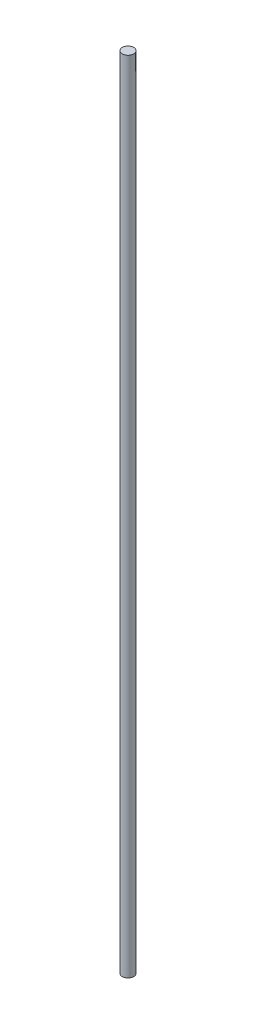
ISO-10303-21;
HEADER;
FILE_DESCRIPTION(('STEP AP214'),'2;1');
FILE_NAME('part.step','',(''),(''),'','','');
FILE_SCHEMA(('AUTOMOTIVE_DESIGN { 1 0 10303 214 1 1 1 1 }'));
ENDSEC;
DATA;
#1=APPLICATION_CONTEXT('core data for automotive mechanical design processes');
#2=APPLICATION_PROTOCOL_DEFINITION('international standard','automotive_design',2000,#1);
#3=PRODUCT_CONTEXT('',#1,'mechanical');
#4=PRODUCT('Part','Part','',(#3));
#5=PRODUCT_RELATED_PRODUCT_CATEGORY('part','',(#4));
#6=PRODUCT_DEFINITION_FORMATION('','',#4);
#7=PRODUCT_DEFINITION_CONTEXT('part definition',#1,'design');
#8=PRODUCT_DEFINITION('design','',#6,#7);
#9=PRODUCT_DEFINITION_SHAPE('','',#8);
#10=(LENGTH_UNIT() NAMED_UNIT(*) SI_UNIT(.MILLI.,.METRE.));
#11=(NAMED_UNIT(*) PLANE_ANGLE_UNIT() SI_UNIT($,.RADIAN.));
#12=(NAMED_UNIT(*) SI_UNIT($,.STERADIAN.) SOLID_ANGLE_UNIT());
#13=UNCERTAINTY_MEASURE_WITH_UNIT(LENGTH_MEASURE(1.E-05),#10,'distance_accuracy_value','');
#14=(GEOMETRIC_REPRESENTATION_CONTEXT(3) GLOBAL_UNCERTAINTY_ASSIGNED_CONTEXT((#13)) GLOBAL_UNIT_ASSIGNED_CONTEXT((#10,
#11,#12)) REPRESENTATION_CONTEXT('',''));
#15=CARTESIAN_POINT('',(0.,0.,0.));
#16=DIRECTION('',(0.,0.,1.));
#17=DIRECTION('',(1.,0.,0.));
#18=AXIS2_PLACEMENT_3D('',#15,#16,#17);
#19=CARTESIAN_POINT('',(0.,892.,0.));
#20=DIRECTION('',(0.,-1.,0.));
#21=DIRECTION('',(0.,0.,-1.));
#22=AXIS2_PLACEMENT_3D('',#19,#20,#21);
#23=CYLINDRICAL_SURFACE('',#22,6.35);
#24=CARTESIAN_POINT('',(0.,892.,0.));
#25=DIRECTION('',(0.,1.,0.));
#26=DIRECTION('',(0.,0.,1.));
#27=AXIS2_PLACEMENT_3D('',#24,#25,#26);
#28=CIRCLE('',#27,6.35);
#29=CARTESIAN_POINT('',(0.,892.,-6.35));
#30=VERTEX_POINT('',#29);
#31=EDGE_CURVE('E10',#30,#30,#28,.T.);
#32=CARTESIAN_POINT('',(0.,0.,0.));
#33=DIRECTION('',(0.,1.,0.));
#34=DIRECTION('',(0.,0.,1.));
#35=AXIS2_PLACEMENT_3D('',#32,#33,#34);
#36=CIRCLE('',#35,6.35);
#37=CARTESIAN_POINT('',(0.,0.,-6.35));
#38=VERTEX_POINT('',#37);
#39=EDGE_CURVE('E33',#38,#38,#36,.T.);
#40=CARTESIAN_POINT('',(0.,892.,-6.35));
#41=CARTESIAN_POINT('',(0.,882.708333333333,-6.35));
#42=CARTESIAN_POINT('',(0.,873.416666666667,-6.35));
#43=CARTESIAN_POINT('',(0.,854.833333333333,-6.35));
#44=CARTESIAN_POINT('',(0.,845.541666666667,-6.35));
#45=CARTESIAN_POINT('',(0.,826.958333333333,-6.35));
#46=CARTESIAN_POINT('',(0.,817.666666666667,-6.35));
#47=CARTESIAN_POINT('',(0.,799.083333333333,-6.35));
#48=CARTESIAN_POINT('',(0.,789.791666666667,-6.35));
#49=CARTESIAN_POINT('',(0.,771.208333333333,-6.35));
#50=CARTESIAN_POINT('',(0.,761.916666666667,-6.35));
#51=CARTESIAN_POINT('',(0.,743.333333333333,-6.35));
#52=CARTESIAN_POINT('',(0.,734.041666666667,-6.35));
#53=CARTESIAN_POINT('',(0.,715.458333333333,-6.35));
#54=CARTESIAN_POINT('',(0.,706.166666666667,-6.35));
#55=CARTESIAN_POINT('',(0.,687.583333333333,-6.35));
#56=CARTESIAN_POINT('',(0.,678.291666666667,-6.35));
#57=CARTESIAN_POINT('',(0.,659.708333333333,-6.35));
#58=CARTESIAN_POINT('',(0.,650.416666666667,-6.35));
#59=CARTESIAN_POINT('',(0.,631.833333333333,-6.35));
#60=CARTESIAN_POINT('',(0.,622.541666666667,-6.35));
#61=CARTESIAN_POINT('',(0.,603.958333333333,-6.35));
#62=CARTESIAN_POINT('',(0.,594.666666666667,-6.35));
#63=CARTESIAN_POINT('',(0.,576.083333333333,-6.35));
#64=CARTESIAN_POINT('',(0.,566.791666666667,-6.35));
#65=CARTESIAN_POINT('',(0.,548.208333333333,-6.35));
#66=CARTESIAN_POINT('',(0.,538.916666666667,-6.35));
#67=CARTESIAN_POINT('',(0.,520.333333333333,-6.35));
#68=CARTESIAN_POINT('',(0.,511.041666666667,-6.35));
#69=CARTESIAN_POINT('',(0.,492.458333333333,-6.35));
#70=CARTESIAN_POINT('',(0.,483.166666666667,-6.35));
#71=CARTESIAN_POINT('',(0.,464.583333333333,-6.35));
#72=CARTESIAN_POINT('',(0.,455.291666666667,-6.35));
#73=CARTESIAN_POINT('',(0.,436.708333333333,-6.35));
#74=CARTESIAN_POINT('',(0.,427.416666666667,-6.35));
#75=CARTESIAN_POINT('',(0.,408.833333333333,-6.35));
#76=CARTESIAN_POINT('',(0.,399.541666666667,-6.35));
#77=CARTESIAN_POINT('',(0.,380.958333333333,-6.35));
#78=CARTESIAN_POINT('',(0.,371.666666666667,-6.35));
#79=CARTESIAN_POINT('',(0.,353.083333333333,-6.35));
#80=CARTESIAN_POINT('',(0.,343.791666666667,-6.35));
#81=CARTESIAN_POINT('',(0.,325.208333333333,-6.35));
#82=CARTESIAN_POINT('',(0.,315.916666666667,-6.35));
#83=CARTESIAN_POINT('',(0.,297.333333333333,-6.35));
#84=CARTESIAN_POINT('',(0.,288.041666666667,-6.35));
#85=CARTESIAN_POINT('',(0.,269.458333333333,-6.35));
#86=CARTESIAN_POINT('',(0.,260.166666666667,-6.35));
#87=CARTESIAN_POINT('',(0.,241.583333333333,-6.35));
#88=CARTESIAN_POINT('',(0.,232.291666666667,-6.35));
#89=CARTESIAN_POINT('',(0.,213.708333333333,-6.35));
#90=CARTESIAN_POINT('',(0.,204.416666666667,-6.35));
#91=CARTESIAN_POINT('',(0.,185.833333333333,-6.35));
#92=CARTESIAN_POINT('',(0.,176.541666666667,-6.35));
#93=CARTESIAN_POINT('',(0.,157.958333333333,-6.35));
#94=CARTESIAN_POINT('',(0.,148.666666666667,-6.35));
#95=CARTESIAN_POINT('',(0.,130.083333333333,-6.35));
#96=CARTESIAN_POINT('',(0.,120.791666666667,-6.35));
#97=CARTESIAN_POINT('',(0.,102.208333333333,-6.35));
#98=CARTESIAN_POINT('',(0.,92.9166666666666,-6.35));
#99=CARTESIAN_POINT('',(0.,74.3333333333333,-6.35));
#100=CARTESIAN_POINT('',(0.,65.0416666666666,-6.35));
#101=CARTESIAN_POINT('',(0.,46.4583333333333,-6.35));
#102=CARTESIAN_POINT('',(0.,37.1666666666666,-6.35));
#103=CARTESIAN_POINT('',(0.,18.5833333333333,-6.35));
#104=CARTESIAN_POINT('',(0.,9.29166666666665,-6.35));
#105=CARTESIAN_POINT('',(0.,0.,-6.35));
#106=B_SPLINE_CURVE_WITH_KNOTS('',3,(#40,#41,#42,#43,#44,#45,#46,#47,#48,#49,#50,#51,#52,#53,
#54,#55,#56,#57,#58,#59,#60,#61,#62,#63,#64,#65,#66,#67,#68,#69,#70,#71,#72,#73,#74,#75,#76,#77,
#78,#79,#80,#81,#82,#83,#84,#85,#86,#87,#88,#89,#90,#91,#92,#93,#94,#95,#96,#97,#98,#99,#100,
#101,#102,#103,#104,#105),.UNSPECIFIED.,.F.,.F.,(4,2,2,2,2,2,2,2,2,2,2,2,2,2,2,2,2,2,2,2,2,2,2,
2,2,2,2,2,2,2,2,2,4),(0.,27.875,55.75,83.6249999999999,111.5,139.375,167.25,195.125,223.,
250.875,278.75,306.625,334.5,362.375,390.25,418.125,446.,473.875,501.75,529.625,557.5,585.375,
613.25,641.125,669.,696.875,724.75,752.625,780.5,808.375,836.25,864.125,892.),.UNSPECIFIED.);
#107=EDGE_CURVE('BSEAM30',#30,#38,#106,.T.);
#108=ORIENTED_EDGE('',*,*,#31,.F.);
#109=ORIENTED_EDGE('',*,*,#39,.T.);
#110=ORIENTED_EDGE('',*,*,#107,.T.);
#111=ORIENTED_EDGE('',*,*,#107,.F.);
#112=EDGE_LOOP('',(#108,#110,#109,#111));
#113=FACE_BOUND('',#112,.T.);
#114=ADVANCED_FACE('F30',(#113),#23,.T.);
#115=CARTESIAN_POINT('',(0.,892.,0.));
#116=DIRECTION('',(0.,1.,0.));
#117=DIRECTION('',(0.,0.,1.));
#118=AXIS2_PLACEMENT_3D('',#115,#116,#117);
#119=PLANE('',#118);
#120=ORIENTED_EDGE('',*,*,#31,.T.);
#121=EDGE_LOOP('',(#120));
#122=FACE_BOUND('',#121,.T.);
#123=ADVANCED_FACE('F45',(#122),#119,.T.);
#124=CARTESIAN_POINT('',(0.,0.,0.));
#125=DIRECTION('',(0.,1.,0.));
#126=DIRECTION('',(0.,0.,1.));
#127=AXIS2_PLACEMENT_3D('',#124,#125,#126);
#128=PLANE('',#127);
#129=ORIENTED_EDGE('',*,*,#39,.F.);
#130=EDGE_LOOP('',(#129));
#131=FACE_BOUND('',#130,.T.);
#132=ADVANCED_FACE('F43',(#131),#128,.F.);
#133=CLOSED_SHELL('',(#114,#123,#132));
#134=MANIFOLD_SOLID_BREP('B2',#133);
#135=ADVANCED_BREP_SHAPE_REPRESENTATION('',(#18,#134),#14);
#136=SHAPE_DEFINITION_REPRESENTATION(#9,#135);
ENDSEC;
END-ISO-10303-21;
